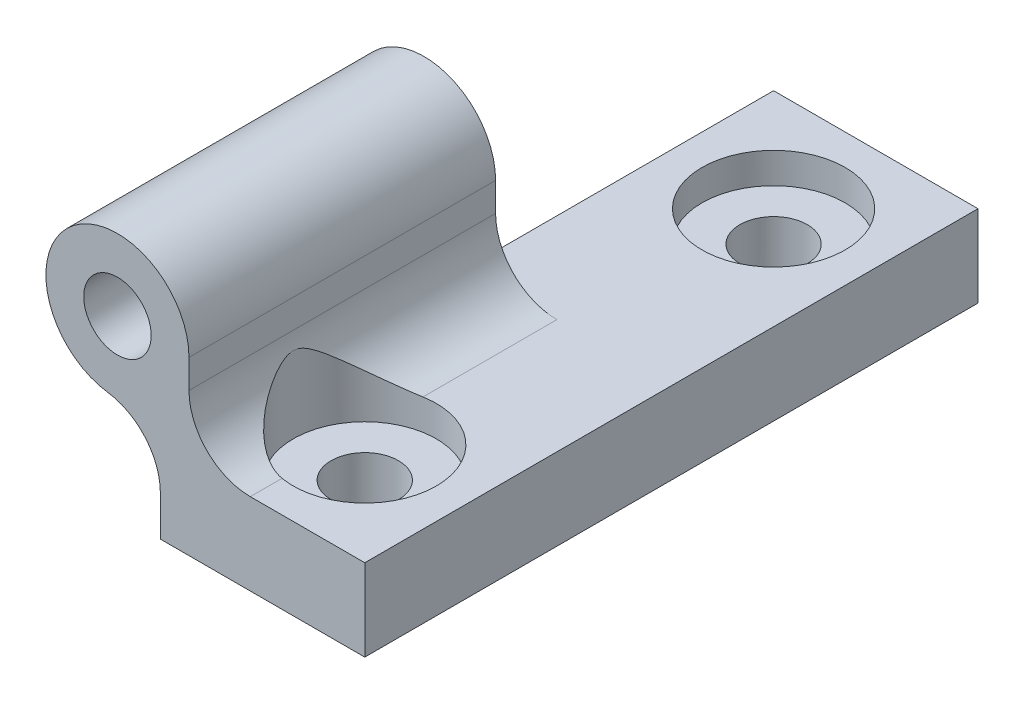
ISO-10303-21;
HEADER;
FILE_DESCRIPTION(('STEP AP214'),'2;1');
FILE_NAME('part.step','',(''),(''),'','','');
FILE_SCHEMA(('AUTOMOTIVE_DESIGN { 1 0 10303 214 1 1 1 1 }'));
ENDSEC;
DATA;
#1=APPLICATION_CONTEXT('core data for automotive mechanical design processes');
#2=APPLICATION_PROTOCOL_DEFINITION('international standard','automotive_design',2000,#1);
#3=PRODUCT_CONTEXT('',#1,'mechanical');
#4=PRODUCT('Part','Part','',(#3));
#5=PRODUCT_RELATED_PRODUCT_CATEGORY('part','',(#4));
#6=PRODUCT_DEFINITION_FORMATION('','',#4);
#7=PRODUCT_DEFINITION_CONTEXT('part definition',#1,'design');
#8=PRODUCT_DEFINITION('design','',#6,#7);
#9=PRODUCT_DEFINITION_SHAPE('','',#8);
#10=(LENGTH_UNIT() NAMED_UNIT(*) SI_UNIT(.MILLI.,.METRE.));
#11=(NAMED_UNIT(*) PLANE_ANGLE_UNIT() SI_UNIT($,.RADIAN.));
#12=(NAMED_UNIT(*) SI_UNIT($,.STERADIAN.) SOLID_ANGLE_UNIT());
#13=UNCERTAINTY_MEASURE_WITH_UNIT(LENGTH_MEASURE(1.E-05),#10,'distance_accuracy_value','');
#14=(GEOMETRIC_REPRESENTATION_CONTEXT(3) GLOBAL_UNCERTAINTY_ASSIGNED_CONTEXT((#13)) GLOBAL_UNIT_ASSIGNED_CONTEXT((#10,
#11,#12)) REPRESENTATION_CONTEXT('',''));
#15=CARTESIAN_POINT('',(0.,0.,0.));
#16=DIRECTION('',(0.,0.,1.));
#17=DIRECTION('',(1.,0.,0.));
#18=AXIS2_PLACEMENT_3D('',#15,#16,#17);
#19=CARTESIAN_POINT('',(4.4,7.,-30.));
#20=DIRECTION('',(0.,0.,-1.));
#21=DIRECTION('',(-1.,0.,0.));
#22=AXIS2_PLACEMENT_3D('',#19,#20,#21);
#23=CYLINDRICAL_SURFACE('',#22,3.);
#24=CARTESIAN_POINT('',(5.,9.93938769133981,-8.5));
#25=CARTESIAN_POINT('',(5.14616523007527,9.90954889476214,-8.49999797530727));
#26=CARTESIAN_POINT('',(5.29009314929453,9.86873614830836,-8.49076872619049));
#27=CARTESIAN_POINT('',(5.56862581763732,9.7670136978381,-8.45636031064131));
#28=CARTESIAN_POINT('',(5.70322140635735,9.70608457672708,-8.43116571215736));
#29=CARTESIAN_POINT('',(5.95881284678429,9.56731667401858,-8.36866096336098));
#30=CARTESIAN_POINT('',(6.07990240958712,9.48960704129906,-8.33144232518242));
#31=CARTESIAN_POINT('',(6.30797443263063,9.3194614526653,-8.24868261273146));
#32=CARTESIAN_POINT('',(6.41495295198813,9.22702139873873,-8.20313922198764));
#33=CARTESIAN_POINT('',(6.62647969760225,9.01686410429554,-8.10161117528796));
#34=CARTESIAN_POINT('',(6.72903281034261,8.89743016739083,-8.04503363657305));
#35=CARTESIAN_POINT('',(6.91440752632228,8.64390937103713,-7.93203441609619));
#36=CARTESIAN_POINT('',(6.99721576606571,8.50981267674029,-7.87561286529246));
#37=CARTESIAN_POINT('',(7.13464122132546,8.24183052711168,-7.77485912082494));
#38=CARTESIAN_POINT('',(7.19122032191812,8.10920021529855,-7.72988453111071));
#39=CARTESIAN_POINT('',(7.28534084584629,7.83416122212644,-7.65160224912541));
#40=CARTESIAN_POINT('',(7.32292203765841,7.69177368161188,-7.61827023097746));
#41=CARTESIAN_POINT('',(7.37251633403228,7.42375033505116,-7.57334675038038));
#42=CARTESIAN_POINT('',(7.38769569882036,7.29916076685386,-7.55909949770294));
#43=CARTESIAN_POINT('',(7.40223557391895,7.04829195910606,-7.54546300774461));
#44=CARTESIAN_POINT('',(7.401609152729,6.92201420172669,-7.54606149573947));
#45=CARTESIAN_POINT('',(7.38462372550094,6.67176429150367,-7.56196893795489));
#46=CARTESIAN_POINT('',(7.36829447282878,6.54778823022219,-7.5772500717882));
#47=CARTESIAN_POINT('',(7.32096487448203,6.30476918576845,-7.6199459707029));
#48=CARTESIAN_POINT('',(7.2899410503671,6.18573442985234,-7.6473801489094));
#49=CARTESIAN_POINT('',(7.19995567312367,5.90971996294337,-7.72301743513854));
#50=CARTESIAN_POINT('',(7.13483184109238,5.75583924913466,-7.77514968993084));
#51=CARTESIAN_POINT('',(6.98154685233603,5.46277298756185,-7.88660149527526));
#52=CARTESIAN_POINT('',(6.89334173582287,5.32361620044896,-7.94593464350332));
#53=CARTESIAN_POINT('',(6.69338178426066,5.05874813415473,-8.06533980344106));
#54=CARTESIAN_POINT('',(6.58119381061948,4.93335898759396,-8.12540306817026));
#55=CARTESIAN_POINT('',(6.3355016807538,4.70168757657788,-8.23799913269674));
#56=CARTESIAN_POINT('',(6.20203396805717,4.59537329457342,-8.29054452078622));
#57=CARTESIAN_POINT('',(5.94292280584148,4.42342762598627,-8.37278639694261));
#58=CARTESIAN_POINT('',(5.82064881172979,4.35390426766148,-8.40492978469583));
#59=CARTESIAN_POINT('',(5.56530751444939,4.23196330542529,-8.45649318144039));
#60=CARTESIAN_POINT('',(5.4322476626993,4.17953401571973,-8.47592189159005));
#61=CARTESIAN_POINT('',(5.15782137358227,4.09371704972252,-8.49916369532805));
#62=CARTESIAN_POINT('',(5.01640923416799,4.06044742820154,-8.50288085095849));
#63=CARTESIAN_POINT('',(4.73088781196453,4.01480546110324,-8.49255632321381));
#64=CARTESIAN_POINT('',(4.58677958462502,4.00242510410137,-8.47852145168877));
#65=CARTESIAN_POINT('',(4.31553676286155,3.99843106951048,-8.43489237111817));
#66=CARTESIAN_POINT('',(4.18814643495097,4.00486368278833,-8.40699529285465));
#67=CARTESIAN_POINT('',(3.93886371319041,4.03299872527093,-8.33777371860158));
#68=CARTESIAN_POINT('',(3.81697227070366,4.05470378606557,-8.29644690920047));
#69=CARTESIAN_POINT('',(3.57583628038878,4.11264300906801,-8.19990490092087));
#70=CARTESIAN_POINT('',(3.45695997337507,4.14948914871436,-8.14414669719342));
#71=CARTESIAN_POINT('',(3.22952060533393,4.23508249018059,-8.02193707454139));
#72=CARTESIAN_POINT('',(3.12096203112408,4.28383483699196,-7.95548103703888));
#73=CARTESIAN_POINT('',(2.85854597049393,4.42004967815323,-7.77516402810462));
#74=CARTESIAN_POINT('',(2.71228512455993,4.51412063781005,-7.65522017002793));
#75=CARTESIAN_POINT('',(2.44574190982451,4.7176476638258,-7.40000473298248));
#76=CARTESIAN_POINT('',(2.32554601269479,4.82715301061528,-7.26468433753864));
#77=CARTESIAN_POINT('',(2.14539100468904,5.01810916007534,-7.02866297442145));
#78=CARTESIAN_POINT('',(2.07856947844767,5.09706595149263,-6.93105986034486));
#79=CARTESIAN_POINT('',(1.95580428696465,5.25755250141986,-6.73108482182953));
#80=CARTESIAN_POINT('',(1.89986938078644,5.33908427089117,-6.62870913892621));
#81=CARTESIAN_POINT('',(1.79864694753764,5.5026148457096,-6.41945481477322));
#82=CARTESIAN_POINT('',(1.75334326942948,5.58461274621642,-6.3125832987868));
#83=CARTESIAN_POINT('',(1.69317542470313,5.7057277772819,-6.14817281461985));
#84=CARTESIAN_POINT('',(1.67442430751721,5.74576770510329,-6.09271209112502));
#85=CARTESIAN_POINT('',(1.6395162425719,5.82459204874285,-5.98011424936832));
#86=CARTESIAN_POINT('',(1.6233586893842,5.86337675588066,-5.92297752603734));
#87=CARTESIAN_POINT('',(1.59020502560092,5.94760156785077,-5.79297293437266));
#88=CARTESIAN_POINT('',(1.57389891804643,5.99247277067748,-5.71955501831174));
#89=CARTESIAN_POINT('',(1.54558700443448,6.0757508735677,-5.56828271821682));
#90=CARTESIAN_POINT('',(1.53357426626532,6.11416814056357,-5.49043572320223));
#91=CARTESIAN_POINT('',(1.51771916104109,6.16755302184325,-5.35586682397735));
#92=CARTESIAN_POINT('',(1.51248799913627,6.18606738488119,-5.30077006555895));
#93=CARTESIAN_POINT('',(1.50461857964243,6.21451283308225,-5.18831031383168));
#94=CARTESIAN_POINT('',(1.50197028035487,6.22447714097927,-5.13095700630292));
#95=CARTESIAN_POINT('',(1.49954493773438,6.23358432666008,-5.01468232521382));
#96=CARTESIAN_POINT('',(1.49979700854609,6.23261747831335,-4.95575098676155));
#97=CARTESIAN_POINT('',(1.50320938533872,6.21984735860229,-4.83911349250408));
#98=CARTESIAN_POINT('',(1.50637713527786,6.20801635036342,-4.78141085965629));
#99=CARTESIAN_POINT('',(1.51737799797032,6.16870357562694,-4.64174269858473));
#100=CARTESIAN_POINT('',(1.5267150257392,6.13645017587915,-4.56131954861776));
#101=CARTESIAN_POINT('',(1.54995925275707,6.06256597973772,-4.40545180547919));
#102=CARTESIAN_POINT('',(1.56389230782748,6.02088255968393,-4.330038347314));
#103=CARTESIAN_POINT('',(1.59201711712035,5.94334749393929,-4.20068854895772));
#104=CARTESIAN_POINT('',(1.60534200585179,5.90850174725421,-4.14594625414423));
#105=CARTESIAN_POINT('',(1.63428470177588,5.83711388778591,-4.03819225471347));
#106=CARTESIAN_POINT('',(1.64990318673521,5.80057127576249,-3.98518106732487));
#107=CARTESIAN_POINT('',(1.70018567659167,5.68942763365335,-3.82810056233713));
#108=CARTESIAN_POINT('',(1.73824708128058,5.61339589237391,-3.72611780774876));
#109=CARTESIAN_POINT('',(1.82347209831521,5.46078557625666,-3.52642153627647));
#110=CARTESIAN_POINT('',(1.87063961746568,5.38420678034437,-3.42870987396997));
#111=CARTESIAN_POINT('',(1.97428474477503,5.23241836184155,-3.23736692615516));
#112=CARTESIAN_POINT('',(2.03075454899933,5.15720764976419,-3.14373230285922));
#113=CARTESIAN_POINT('',(2.14328745657393,5.02169809395881,-2.97573347262212));
#114=CARTESIAN_POINT('',(2.19789092553043,4.96098063002829,-2.9007320747863));
#115=CARTESIAN_POINT('',(2.31404530936469,4.84229336601027,-2.75402269441648));
#116=CARTESIAN_POINT('',(2.37559749396369,4.78432407084548,-2.68231531716938));
#117=CARTESIAN_POINT('',(2.57077308973386,4.61602051749601,-2.47311926596463));
#118=CARTESIAN_POINT('',(2.71523585729514,4.5108908170855,-2.3410685214944));
#119=CARTESIAN_POINT('',(2.99004145078963,4.34856405565603,-2.13097374900376));
#120=CARTESIAN_POINT('',(3.11353446470086,4.28610759201297,-2.04801022867436));
#121=CARTESIAN_POINT('',(3.3753638778029,4.17685264849075,-1.89623503965168));
#122=CARTESIAN_POINT('',(3.51368297545885,4.13003617446302,-1.82740714299792));
#123=CARTESIAN_POINT('',(3.78059188914709,4.06192502098001,-1.71661691309092));
#124=CARTESIAN_POINT('',(3.90741589070442,4.03781579642086,-1.67215242967631));
#125=CARTESIAN_POINT('',(4.16729060007702,4.00618308073237,-1.59782194259235));
#126=CARTESIAN_POINT('',(4.30033757868726,3.99864978306917,-1.56794731551901));
#127=CARTESIAN_POINT('',(4.56929006771349,4.00175421985363,-1.52392279967813));
#128=CARTESIAN_POINT('',(4.70520352714315,4.01245167672972,-1.50982484475363));
#129=CARTESIAN_POINT('',(4.97499310818802,4.05246164453546,-1.49748426996542));
#130=CARTESIAN_POINT('',(5.1088689859179,4.08177636616548,-1.4992435333887));
#131=CARTESIAN_POINT('',(5.36374646984714,4.15607102300492,-1.51672640664668));
#132=CARTESIAN_POINT('',(5.48505658534421,4.20017904903851,-1.53173573447827));
#133=CARTESIAN_POINT('',(5.71945142088979,4.30269977211478,-1.57267433642544));
#134=CARTESIAN_POINT('',(5.832534361213,4.36111555238702,-1.59860596509497));
#135=CARTESIAN_POINT('',(6.05989034850475,4.49718438305635,-1.66204221404656));
#136=CARTESIAN_POINT('',(6.17308657400587,4.57619904328656,-1.70046366080128));
#137=CARTESIAN_POINT('',(6.38615826468599,4.7474692436521,-1.78414948232777));
#138=CARTESIAN_POINT('',(6.48602240494422,4.83973590432355,-1.82941960594701));
#139=CARTESIAN_POINT('',(6.68990312151616,5.05514765277088,-1.93247934010799));
#140=CARTESIAN_POINT('',(6.79090954823491,5.18080225410772,-1.99098551426016));
#141=CARTESIAN_POINT('',(6.97193366379524,5.44722691924573,-2.10638702362663));
#142=CARTESIAN_POINT('',(7.05194211692452,5.58800359607794,-2.16328164023454));
#143=CARTESIAN_POINT('',(7.17882042622236,5.86103027278923,-2.25990768715716));
#144=CARTESIAN_POINT('',(7.22887645562897,5.99133303498065,-2.30093346017679));
#145=CARTESIAN_POINT('',(7.31085307333647,6.26066656712456,-2.37075952893159));
#146=CARTESIAN_POINT('',(7.3428090436279,6.39967971476728,-2.39958364838072));
#147=CARTESIAN_POINT('',(7.37583328578685,6.6130814886964,-2.42985888162811));
#148=CARTESIAN_POINT('',(7.38436166528288,6.68546954287469,-2.43779812412964));
#149=CARTESIAN_POINT('',(7.39612544421322,6.83102870476301,-2.4487937162081));
#150=CARTESIAN_POINT('',(7.3993635244611,6.90419939694435,-2.45185253887732));
#151=CARTESIAN_POINT('',(7.40046632531864,7.05061461345554,-2.45289148981154));
#152=CARTESIAN_POINT('',(7.39833125727157,7.12385913476818,-2.45087181783016));
#153=CARTESIAN_POINT('',(7.38874920026089,7.26967306803293,-2.44189207020435));
#154=CARTESIAN_POINT('',(7.38130237260508,7.34224250041838,-2.43493214458584));
#155=CARTESIAN_POINT('',(7.35418676179592,7.53670702731869,-2.4099488994571));
#156=CARTESIAN_POINT('',(7.32960573525894,7.65739858994502,-2.387587308853));
#157=CARTESIAN_POINT('',(7.26669979307112,7.89271184517695,-2.33283170082146));
#158=CARTESIAN_POINT('',(7.22835934880116,8.00732651108943,-2.30042635385729));
#159=CARTESIAN_POINT('',(7.11841166512631,8.28099586188417,-2.21265629923126));
#160=CARTESIAN_POINT('',(7.03962298210082,8.43599986220788,-2.1536145896595));
#161=CARTESIAN_POINT('',(6.85751527443179,8.72930926068701,-2.03154976910234));
#162=CARTESIAN_POINT('',(6.75414906777972,8.86758175896542,-1.96851917349754));
#163=CARTESIAN_POINT('',(6.52276338383331,9.12707200690791,-1.84586461798307));
#164=CARTESIAN_POINT('',(6.39445997670634,9.24806245025797,-1.78629127578618));
#165=CARTESIAN_POINT('',(6.11558097121678,9.4674011419989,-1.67920836377664));
#166=CARTESIAN_POINT('',(5.96506158058784,9.56580497551624,-1.63166914790906));
#167=CARTESIAN_POINT('',(5.68646711457618,9.71349131725052,-1.56581325682075));
#168=CARTESIAN_POINT('',(5.56266746277021,9.76889550213797,-1.54311762605577));
#169=CARTESIAN_POINT('',(5.30714925839275,9.86278797692952,-1.51113411000051));
#170=CARTESIAN_POINT('',(5.17543674944662,9.90128899488777,-1.50183612422622));
#171=CARTESIAN_POINT('',(4.9072273775003,9.96000548382571,-1.49865197693063));
#172=CARTESIAN_POINT('',(4.77071389231894,9.98014922100593,-1.50482592511701));
#173=CARTESIAN_POINT('',(4.4979225029619,10.001521108683,-1.53348553830348));
#174=CARTESIAN_POINT('',(4.36164460021518,10.0027491448436,-1.55597130189971));
#175=CARTESIAN_POINT('',(4.10173061719173,9.98780545106763,-1.61476462234758));
#176=CARTESIAN_POINT('',(3.97782496960229,9.97266544625048,-1.65016942510248));
#177=CARTESIAN_POINT('',(3.736915826882,9.92836941938699,-1.73336698778613));
#178=CARTESIAN_POINT('',(3.61991543303177,9.89920715265531,-1.78116526265963));
#179=CARTESIAN_POINT('',(3.35519440794114,9.81668938582495,-1.90599654296957));
#180=CARTESIAN_POINT('',(3.21106109782545,9.7584381260873,-1.98740584890103));
#181=CARTESIAN_POINT('',(2.94083360468298,9.62556954570986,-2.16519422084317));
#182=CARTESIAN_POINT('',(2.81476560121649,9.55092886270106,-2.26159459811229));
#183=CARTESIAN_POINT('',(2.53804562584356,9.36023892017161,-2.50324883994596));
#184=CARTESIAN_POINT('',(2.39527168192856,9.23903038375526,-2.65347345625105));
#185=CARTESIAN_POINT('',(2.20543183532914,9.04744297649457,-2.89033076215936));
#186=CARTESIAN_POINT('',(2.14608270704094,8.98176730673901,-2.97142987167407));
#187=CARTESIAN_POINT('',(2.03530159597374,8.84816599108323,-3.13707794811826));
#188=CARTESIAN_POINT('',(1.98386575170226,8.78024146236252,-3.22162520678894));
#189=CARTESIAN_POINT('',(1.88692935083589,8.64071571501876,-3.39712340963562));
#190=CARTESIAN_POINT('',(1.84171273150536,8.56907062845467,-3.48819541954925));
#191=CARTESIAN_POINT('',(1.75922208355237,8.42587865653804,-3.67420616002936));
#192=CARTESIAN_POINT('',(1.72196152543221,8.35433213834661,-3.76915112935042));
#193=CARTESIAN_POINT('',(1.65557429941299,8.21410768257909,-3.96303755333325));
#194=CARTESIAN_POINT('',(1.62639981399601,8.14541501635126,-4.06195137324635));
#195=CARTESIAN_POINT('',(1.58873769634263,8.0478701819436,-4.21512643299358));
#196=CARTESIAN_POINT('',(1.57721226969836,8.01631169948029,-4.26690889666662));
#197=CARTESIAN_POINT('',(1.55627747070524,7.9561642791744,-4.37256295203854));
#198=CARTESIAN_POINT('',(1.54686652135307,7.92757313687396,-4.42643295143316));
#199=CARTESIAN_POINT('',(1.52957812526468,7.87268225047824,-4.54186546874939));
#200=CARTESIAN_POINT('',(1.52191891570003,7.8468295335154,-4.60368141376525));
#201=CARTESIAN_POINT('',(1.50981193351153,7.80455498531944,-4.73056670339834));
#202=CARTESIAN_POINT('',(1.5053443341531,7.78807506178112,-4.79561322921151));
#203=CARTESIAN_POINT('',(1.50063338334757,7.77054827839645,-4.9148582268509));
#204=CARTESIAN_POINT('',(1.49972918382329,7.76709322109237,-4.96865698801744));
#205=CARTESIAN_POINT('',(1.50041353318516,7.76967465175709,-5.07604227635759));
#206=CARTESIAN_POINT('',(1.50200438056122,7.77571989161064,-5.12962856219199));
#207=CARTESIAN_POINT('',(1.50847883757195,7.79955856763176,-5.25379541988602));
#208=CARTESIAN_POINT('',(1.51433305526817,7.82076822020047,-5.32363462322017));
#209=CARTESIAN_POINT('',(1.52960429998863,7.87267288510314,-5.45943176480063));
#210=CARTESIAN_POINT('',(1.53904198635719,7.9034227065597,-5.52536458437045));
#211=CARTESIAN_POINT('',(1.56653992143578,7.98705319953148,-5.68628355896013));
#212=CARTESIAN_POINT('',(1.58654826122632,8.04327332945565,-5.77914966237248));
#213=CARTESIAN_POINT('',(1.63294496780719,8.16080117664488,-5.96002480971579));
#214=CARTESIAN_POINT('',(1.65934716778963,8.22211973292208,-6.04802280734517));
#215=CARTESIAN_POINT('',(1.71848812263291,8.34695206686566,-6.22066283914076));
#216=CARTESIAN_POINT('',(1.75124469142043,8.41047159366122,-6.30529461325307));
#217=CARTESIAN_POINT('',(1.82306261009072,8.53777124344175,-6.47147930201054));
#218=CARTESIAN_POINT('',(1.86211806756065,8.60155106909643,-6.55303500708853));
#219=CARTESIAN_POINT('',(1.95033592507959,8.73377906273952,-6.7202407080186));
#220=CARTESIAN_POINT('',(2.00007773903045,8.80215870964306,-6.80564233484958));
#221=CARTESIAN_POINT('',(2.10742443845769,8.93688718541044,-6.97304386835727));
#222=CARTESIAN_POINT('',(2.16503230593595,9.00323523236537,-7.05504246950901));
#223=CARTESIAN_POINT('',(2.34976426398501,9.19734846182452,-7.29497189852978));
#224=CARTESIAN_POINT('',(2.48914345763117,9.3207249454987,-7.44750625273976));
#225=CARTESIAN_POINT('',(2.75725577997425,9.51403810346509,-7.69126130458518));
#226=CARTESIAN_POINT('',(2.87766081400753,9.58917373821798,-7.78755142609593));
#227=CARTESIAN_POINT('',(3.13591905064618,9.7245691018084,-7.96644324416862));
#228=CARTESIAN_POINT('',(3.27375438435676,9.78484388137557,-8.04905876194185));
#229=CARTESIAN_POINT('',(3.540576999644,9.87711711307747,-8.18410095212652));
#230=CARTESIAN_POINT('',(3.66710395672106,9.9121766985561,-8.23927107083013));
#231=CARTESIAN_POINT('',(3.92891941575503,9.965785565096,-8.33498907509241));
#232=CARTESIAN_POINT('',(4.06420028406902,9.98434902849632,-8.37554950327557));
#233=CARTESIAN_POINT('',(4.33311417327515,10.0021267361543,-8.43851306856374));
#234=CARTESIAN_POINT('',(4.46649683422619,10.0022539618428,-8.46171615766997));
#235=CARTESIAN_POINT('',(4.73386263895155,9.98437382803468,-8.49246064687384));
#236=CARTESIAN_POINT('',(4.86784579099572,9.96636621802042,-8.50000183061093));
#237=CARTESIAN_POINT('',(5.,9.93938769133981,-8.5));
#238=B_SPLINE_CURVE_WITH_KNOTS('',3,(#24,#25,#26,#27,#28,#29,#30,#31,#32,#33,#34,#35,#36,#37,
#38,#39,#40,#41,#42,#43,#44,#45,#46,#47,#48,#49,#50,#51,#52,#53,#54,#55,#56,#57,#58,#59,#60,#61,
#62,#63,#64,#65,#66,#67,#68,#69,#70,#71,#72,#73,#74,#75,#76,#77,#78,#79,#80,#81,#82,#83,#84,#85,
#86,#87,#88,#89,#90,#91,#92,#93,#94,#95,#96,#97,#98,#99,#100,#101,#102,#103,#104,#105,#106,#107,
#108,#109,#110,#111,#112,#113,#114,#115,#116,#117,#118,#119,#120,#121,#122,#123,#124,#125,#126,
#127,#128,#129,#130,#131,#132,#133,#134,#135,#136,#137,#138,#139,#140,#141,#142,#143,#144,#145,
#146,#147,#148,#149,#150,#151,#152,#153,#154,#155,#156,#157,#158,#159,#160,#161,#162,#163,#164,
#165,#166,#167,#168,#169,#170,#171,#172,#173,#174,#175,#176,#177,#178,#179,#180,#181,#182,#183,
#184,#185,#186,#187,#188,#189,#190,#191,#192,#193,#194,#195,#196,#197,#198,#199,#200,#201,#202,
#203,#204,#205,#206,#207,#208,#209,#210,#211,#212,#213,#214,#215,#216,#217,#218,#219,#220,#221,
#222,#223,#224,#225,#226,#227,#228,#229,#230,#231,#232,#233,#234,#235,#236,#237),.UNSPECIFIED.,
.T.,.F.,(4,2,2,2,2,2,2,2,2,2,2,2,2,2,2,2,2,2,2,2,2,2,2,2,2,2,2,2,2,2,2,2,2,2,2,2,2,2,2,2,2,2,2,
2,2,2,2,2,2,2,2,2,2,2,2,2,2,2,2,2,2,2,2,2,2,2,2,2,2,2,2,2,2,2,2,2,2,2,2,2,2,2,2,2,2,2,2,2,2,2,2,
2,2,2,2,2,2,2,2,2,2,2,2,2,2,2,4),(0.,0.446933418253341,0.894299501147117,1.33833797492452,
1.78250019684355,2.28248319829206,2.7828036379714,3.23432388441307,3.68489500483457,
4.06211917883917,4.43903146754538,4.81523099575943,5.19203363970511,5.71435224921532,
6.2376729814895,6.77139289446253,7.30420839130059,7.73531967850503,8.16613562978073,
8.59957846463427,9.03285502821837,9.42278392370031,9.81278002414761,10.2203917330581,
10.6281798945611,11.2584354260576,11.890750912685,12.3169023417363,12.743395235397,
13.1692359415575,13.3819593066746,13.5946329422951,13.8571197113442,14.1191807316646,
14.293742009048,14.4676218861163,14.6432486933377,14.8193251370951,15.0793142403481,
15.3407916423834,15.5394304419863,15.7381280586939,16.1360047948809,16.5340526133709,
16.9317681838675,17.2640934831119,17.5964796059087,18.2591495607101,18.7415475640709,
19.2233886310804,19.6312648857392,20.0388997705492,20.4478726015549,20.856894004974,
21.2451269070873,21.6334435446294,22.0617516226922,22.4904212423908,23.0029586251036,
23.5157210649893,23.950681599089,24.3847889117296,24.6044419996871,24.8239837457716,
25.0435168567046,25.263043301128,25.6369593110308,26.0112986494558,26.5592998447443,
27.108361666653,27.6640859550158,28.2184275939441,28.6292795452468,29.0398215929289,
29.4519611002609,29.8641030987752,30.2517038587948,30.6394773933443,31.1630235943725,
31.6873209880174,32.4034197719181,32.7633508832569,33.1231057959324,33.4959462106419,
33.8694129664125,34.2406216428048,34.4257032150258,34.61064628951,34.8124622450252,
35.0130133242725,35.173888383568,35.3349117314379,35.5532595648797,35.7728858114077,
36.1032913505371,36.4344182144551,36.7664871411582,37.0982472106202,37.4584479998353,
37.8187857213888,38.5367004197469,39.0495805753272,39.5619391441455,39.9874525873784,
40.41259984571,40.8166857997692,41.2207773360151),.UNSPECIFIED.);
#239=CARTESIAN_POINT('',(4.4,4.,-8.44818792991333));
#240=VERTEX_POINT('',#239);
#241=CARTESIAN_POINT('',(4.4,4.,-1.55181207008667));
#242=VERTEX_POINT('',#241);
#243=EDGE_CURVE('E55',#240,#242,#238,.T.);
#244=ORIENTED_EDGE('',*,*,#243,.F.);
#245=DIRECTION('',(0.,0.,1.));
#246=VECTOR('',#245,1.);
#247=CARTESIAN_POINT('',(4.4,4.,0.));
#248=LINE('',#247,#246);
#249=CARTESIAN_POINT('',(4.39999999999997,4.,-15.));
#250=VERTEX_POINT('',#249);
#251=EDGE_CURVE('E123',#250,#240,#248,.T.);
#252=ORIENTED_EDGE('',*,*,#251,.F.);
#253=CARTESIAN_POINT('',(4.4,7.,-15.));
#254=DIRECTION('',(0.,0.,1.));
#255=DIRECTION('',(1.,0.,0.));
#256=AXIS2_PLACEMENT_3D('',#253,#254,#255);
#257=CIRCLE('',#256,3.);
#258=CARTESIAN_POINT('',(1.4,7.,-15.));
#259=VERTEX_POINT('',#258);
#260=EDGE_CURVE('E315',#250,#259,#257,.F.);
#261=ORIENTED_EDGE('',*,*,#260,.T.);
#262=DIRECTION('',(0.,0.,1.));
#263=VECTOR('',#262,1.);
#264=CARTESIAN_POINT('',(1.4,7.,-30.));
#265=LINE('',#264,#263);
#266=CARTESIAN_POINT('',(1.4,7.,0.));
#267=VERTEX_POINT('',#266);
#268=EDGE_CURVE('E135',#267,#259,#265,.F.);
#269=ORIENTED_EDGE('',*,*,#268,.F.);
#270=CARTESIAN_POINT('',(4.4,7.,0.));
#271=DIRECTION('',(0.,0.,1.));
#272=DIRECTION('',(1.,0.,0.));
#273=AXIS2_PLACEMENT_3D('',#270,#271,#272);
#274=CIRCLE('',#273,3.);
#275=CARTESIAN_POINT('',(4.4,4.,0.));
#276=VERTEX_POINT('',#275);
#277=EDGE_CURVE('E140',#276,#267,#274,.F.);
#278=ORIENTED_EDGE('',*,*,#277,.F.);
#279=EDGE_CURVE('E125',#242,#276,#248,.T.);
#280=ORIENTED_EDGE('',*,*,#279,.F.);
#281=EDGE_LOOP('',(#244,#252,#261,#269,#278,#280));
#282=FACE_BOUND('',#281,.T.);
#283=ADVANCED_FACE('F41',(#282),#23,.F.);
#284=CARTESIAN_POINT('',(5.,11.,-5.));
#285=DIRECTION('',(0.,-1.,0.));
#286=DIRECTION('',(0.,0.,-1.));
#287=AXIS2_PLACEMENT_3D('',#284,#285,#286);
#288=CYLINDRICAL_SURFACE('',#287,1.65);
#289=CARTESIAN_POINT('',(5.,0.,-5.));
#290=DIRECTION('',(0.,-1.,0.));
#291=DIRECTION('',(0.,0.,-1.));
#292=AXIS2_PLACEMENT_3D('',#289,#290,#291);
#293=CIRCLE('',#292,1.65);
#294=CARTESIAN_POINT('',(5.,0.,-6.65));
#295=VERTEX_POINT('',#294);
#296=EDGE_CURVE('E127',#295,#295,#293,.F.);
#297=ORIENTED_EDGE('',*,*,#296,.F.);
#298=EDGE_LOOP('',(#297));
#299=FACE_BOUND('',#298,.T.);
#300=CARTESIAN_POINT('',(5.,2.5,-5.));
#301=DIRECTION('',(0.,1.,0.));
#302=DIRECTION('',(0.,0.,1.));
#303=AXIS2_PLACEMENT_3D('',#300,#301,#302);
#304=CIRCLE('',#303,1.65);
#305=CARTESIAN_POINT('',(5.,2.5,-3.35));
#306=VERTEX_POINT('',#305);
#307=EDGE_CURVE('E169',#306,#306,#304,.T.);
#308=ORIENTED_EDGE('',*,*,#307,.T.);
#309=EDGE_LOOP('',(#308));
#310=FACE_BOUND('',#309,.T.);
#311=ADVANCED_FACE('F193',(#299,#310),#288,.F.);
#312=CARTESIAN_POINT('',(5.,11.,-25.));
#313=DIRECTION('',(0.,-1.,0.));
#314=DIRECTION('',(0.,0.,-1.));
#315=AXIS2_PLACEMENT_3D('',#312,#313,#314);
#316=CYLINDRICAL_SURFACE('',#315,1.65);
#317=CARTESIAN_POINT('',(5.,0.,-25.));
#318=DIRECTION('',(0.,-1.,0.));
#319=DIRECTION('',(0.,0.,-1.));
#320=AXIS2_PLACEMENT_3D('',#317,#318,#319);
#321=CIRCLE('',#320,1.65);
#322=CARTESIAN_POINT('',(5.,0.,-26.65));
#323=VERTEX_POINT('',#322);
#324=EDGE_CURVE('E161',#323,#323,#321,.F.);
#325=ORIENTED_EDGE('',*,*,#324,.F.);
#326=EDGE_LOOP('',(#325));
#327=FACE_BOUND('',#326,.T.);
#328=CARTESIAN_POINT('',(5.,2.5,-25.));
#329=DIRECTION('',(0.,1.,0.));
#330=DIRECTION('',(0.,0.,1.));
#331=AXIS2_PLACEMENT_3D('',#328,#329,#330);
#332=CIRCLE('',#331,1.65);
#333=CARTESIAN_POINT('',(5.,2.5,-23.35));
#334=VERTEX_POINT('',#333);
#335=EDGE_CURVE('E165',#334,#334,#332,.T.);
#336=ORIENTED_EDGE('',*,*,#335,.T.);
#337=EDGE_LOOP('',(#336));
#338=FACE_BOUND('',#337,.T.);
#339=ADVANCED_FACE('F197',(#327,#338),#316,.F.);
#340=CARTESIAN_POINT('',(-2.1,8.4,-30.));
#341=DIRECTION('',(0.,0.,1.));
#342=DIRECTION('',(1.,0.,0.));
#343=AXIS2_PLACEMENT_3D('',#340,#341,#342);
#344=CYLINDRICAL_SURFACE('',#343,3.5);
#345=CARTESIAN_POINT('',(-2.1,8.4,-15.));
#346=DIRECTION('',(0.,0.,1.));
#347=DIRECTION('',(1.,0.,0.));
#348=AXIS2_PLACEMENT_3D('',#345,#346,#347);
#349=CIRCLE('',#348,3.5);
#350=CARTESIAN_POINT('',(-2.58461538461538,4.93371265919946,-15.));
#351=VERTEX_POINT('',#350);
#352=CARTESIAN_POINT('',(1.4,8.4,-15.));
#353=VERTEX_POINT('',#352);
#354=EDGE_CURVE('E322',#351,#353,#349,.F.);
#355=ORIENTED_EDGE('',*,*,#354,.F.);
#356=DIRECTION('',(0.,0.,1.));
#357=VECTOR('',#356,1.);
#358=CARTESIAN_POINT('',(-2.58461538461538,4.93371265919946,-30.));
#359=LINE('',#358,#357);
#360=CARTESIAN_POINT('',(-2.58461538461538,4.93371265919946,0.));
#361=VERTEX_POINT('',#360);
#362=EDGE_CURVE('E149',#351,#361,#359,.T.);
#363=ORIENTED_EDGE('',*,*,#362,.T.);
#364=CARTESIAN_POINT('',(-2.1,8.4,0.));
#365=DIRECTION('',(0.,0.,1.));
#366=DIRECTION('',(1.,0.,0.));
#367=AXIS2_PLACEMENT_3D('',#364,#365,#366);
#368=CIRCLE('',#367,3.5);
#369=CARTESIAN_POINT('',(1.4,8.4,0.));
#370=VERTEX_POINT('',#369);
#371=EDGE_CURVE('E251',#370,#361,#368,.T.);
#372=ORIENTED_EDGE('',*,*,#371,.F.);
#373=DIRECTION('',(0.,0.,1.));
#374=VECTOR('',#373,1.);
#375=CARTESIAN_POINT('',(1.4,8.4,-30.));
#376=LINE('',#375,#374);
#377=EDGE_CURVE('E142',#353,#370,#376,.T.);
#378=ORIENTED_EDGE('',*,*,#377,.F.);
#379=EDGE_LOOP('',(#355,#363,#372,#378));
#380=FACE_BOUND('',#379,.T.);
#381=ADVANCED_FACE('F189',(#380),#344,.T.);
#382=CARTESIAN_POINT('',(1.4,0.,-30.));
#383=DIRECTION('',(-1.,0.,0.));
#384=DIRECTION('',(0.,0.,1.));
#385=AXIS2_PLACEMENT_3D('',#382,#383,#384);
#386=PLANE('',#385);
#387=ORIENTED_EDGE('',*,*,#268,.T.);
#388=DIRECTION('',(0.,1.,0.));
#389=VECTOR('',#388,1.);
#390=CARTESIAN_POINT('',(1.4,0.,-15.));
#391=LINE('',#390,#389);
#392=EDGE_CURVE('E318',#259,#353,#391,.T.);
#393=ORIENTED_EDGE('',*,*,#392,.T.);
#394=ORIENTED_EDGE('',*,*,#377,.T.);
#395=DIRECTION('',(0.,-1.,0.));
#396=VECTOR('',#395,1.);
#397=CARTESIAN_POINT('',(1.4,0.,0.));
#398=LINE('',#397,#396);
#399=EDGE_CURVE('E256',#370,#267,#398,.T.);
#400=ORIENTED_EDGE('',*,*,#399,.T.);
#401=EDGE_LOOP('',(#387,#393,#394,#400));
#402=FACE_BOUND('',#401,.T.);
#403=ADVANCED_FACE('F180',(#402),#386,.F.);
#404=CARTESIAN_POINT('',(0.,4.,-30.));
#405=DIRECTION('',(0.,-1.,0.));
#406=DIRECTION('',(0.,0.,-1.));
#407=AXIS2_PLACEMENT_3D('',#404,#405,#406);
#408=PLANE('',#407);
#409=CARTESIAN_POINT('',(5.,4.,-5.));
#410=DIRECTION('',(0.,-1.,0.));
#411=DIRECTION('',(0.,0.,-1.));
#412=AXIS2_PLACEMENT_3D('',#409,#410,#411);
#413=CIRCLE('',#412,3.5);
#414=EDGE_CURVE('E11',#242,#240,#413,.F.);
#415=ORIENTED_EDGE('',*,*,#414,.F.);
#416=ORIENTED_EDGE('',*,*,#279,.T.);
#417=DIRECTION('',(1.,0.,0.));
#418=VECTOR('',#417,1.);
#419=CARTESIAN_POINT('',(0.,4.,0.));
#420=LINE('',#419,#418);
#421=CARTESIAN_POINT('',(10.,4.,0.));
#422=VERTEX_POINT('',#421);
#423=EDGE_CURVE('E277',#276,#422,#420,.T.);
#424=ORIENTED_EDGE('',*,*,#423,.T.);
#425=DIRECTION('',(0.,0.,1.));
#426=VECTOR('',#425,1.);
#427=CARTESIAN_POINT('',(10.,4.,-30.));
#428=LINE('',#427,#426);
#429=CARTESIAN_POINT('',(10.,4.,-30.));
#430=VERTEX_POINT('',#429);
#431=EDGE_CURVE('E285',#430,#422,#428,.T.);
#432=ORIENTED_EDGE('',*,*,#431,.F.);
#433=DIRECTION('',(1.,0.,0.));
#434=VECTOR('',#433,1.);
#435=CARTESIAN_POINT('',(0.,4.,-30.));
#436=LINE('',#435,#434);
#437=CARTESIAN_POINT('',(0.,4.,-30.));
#438=VERTEX_POINT('',#437);
#439=EDGE_CURVE('E295',#438,#430,#436,.T.);
#440=ORIENTED_EDGE('',*,*,#439,.F.);
#441=DIRECTION('',(0.,0.,-1.));
#442=VECTOR('',#441,1.);
#443=CARTESIAN_POINT('',(0.,4.,-15.));
#444=LINE('',#443,#442);
#445=CARTESIAN_POINT('',(0.,4.,-15.));
#446=VERTEX_POINT('',#445);
#447=EDGE_CURVE('E325',#446,#438,#444,.T.);
#448=ORIENTED_EDGE('',*,*,#447,.F.);
#449=DIRECTION('',(-1.,0.,0.));
#450=VECTOR('',#449,1.);
#451=CARTESIAN_POINT('',(4.39999999999997,4.,-15.));
#452=LINE('',#451,#450);
#453=EDGE_CURVE('E133',#250,#446,#452,.T.);
#454=ORIENTED_EDGE('',*,*,#453,.F.);
#455=ORIENTED_EDGE('',*,*,#251,.T.);
#456=EDGE_LOOP('',(#415,#416,#424,#432,#440,#448,#454,#455));
#457=FACE_BOUND('',#456,.T.);
#458=CARTESIAN_POINT('',(5.,4.,-25.));
#459=DIRECTION('',(0.,-1.,0.));
#460=DIRECTION('',(0.,0.,-1.));
#461=AXIS2_PLACEMENT_3D('',#458,#459,#460);
#462=CIRCLE('',#461,3.5);
#463=CARTESIAN_POINT('',(5.,4.,-28.5));
#464=VERTEX_POINT('',#463);
#465=EDGE_CURVE('E128',#464,#464,#462,.F.);
#466=ORIENTED_EDGE('',*,*,#465,.F.);
#467=EDGE_LOOP('',(#466));
#468=FACE_BOUND('',#467,.T.);
#469=ADVANCED_FACE('F131',(#457,#468),#408,.F.);
#470=CARTESIAN_POINT('',(10.,0.,-30.));
#471=DIRECTION('',(1.,0.,0.));
#472=DIRECTION('',(0.,0.,-1.));
#473=AXIS2_PLACEMENT_3D('',#470,#471,#472);
#474=PLANE('',#473);
#475=DIRECTION('',(0.,1.,0.));
#476=VECTOR('',#475,1.);
#477=CARTESIAN_POINT('',(10.,0.,0.));
#478=LINE('',#477,#476);
#479=CARTESIAN_POINT('',(10.,0.,0.));
#480=VERTEX_POINT('',#479);
#481=EDGE_CURVE('E273',#480,#422,#478,.T.);
#482=ORIENTED_EDGE('',*,*,#481,.F.);
#483=DIRECTION('',(0.,0.,1.));
#484=VECTOR('',#483,1.);
#485=CARTESIAN_POINT('',(10.,0.,-30.));
#486=LINE('',#485,#484);
#487=CARTESIAN_POINT('',(10.,0.,-30.));
#488=VERTEX_POINT('',#487);
#489=EDGE_CURVE('E288',#488,#480,#486,.T.);
#490=ORIENTED_EDGE('',*,*,#489,.F.);
#491=DIRECTION('',(0.,1.,0.));
#492=VECTOR('',#491,1.);
#493=CARTESIAN_POINT('',(10.,0.,-30.));
#494=LINE('',#493,#492);
#495=EDGE_CURVE('E299',#488,#430,#494,.T.);
#496=ORIENTED_EDGE('',*,*,#495,.T.);
#497=ORIENTED_EDGE('',*,*,#431,.T.);
#498=EDGE_LOOP('',(#482,#490,#496,#497));
#499=FACE_BOUND('',#498,.T.);
#500=ADVANCED_FACE('F179',(#499),#474,.T.);
#501=CARTESIAN_POINT('',(0.,0.,-30.));
#502=DIRECTION('',(0.,-1.,0.));
#503=DIRECTION('',(0.,0.,-1.));
#504=AXIS2_PLACEMENT_3D('',#501,#502,#503);
#505=PLANE('',#504);
#506=ORIENTED_EDGE('',*,*,#296,.T.);
#507=EDGE_LOOP('',(#506));
#508=FACE_BOUND('',#507,.T.);
#509=ORIENTED_EDGE('',*,*,#324,.T.);
#510=EDGE_LOOP('',(#509));
#511=FACE_BOUND('',#510,.T.);
#512=DIRECTION('',(1.,0.,0.));
#513=VECTOR('',#512,1.);
#514=CARTESIAN_POINT('',(0.,0.,0.));
#515=LINE('',#514,#513);
#516=CARTESIAN_POINT('',(0.,0.,0.));
#517=VERTEX_POINT('',#516);
#518=EDGE_CURVE('E264',#517,#480,#515,.T.);
#519=ORIENTED_EDGE('',*,*,#518,.F.);
#520=DIRECTION('',(0.,0.,1.));
#521=VECTOR('',#520,1.);
#522=CARTESIAN_POINT('',(0.,0.,-30.));
#523=LINE('',#522,#521);
#524=CARTESIAN_POINT('',(0.,0.,-30.));
#525=VERTEX_POINT('',#524);
#526=EDGE_CURVE('E144',#525,#517,#523,.T.);
#527=ORIENTED_EDGE('',*,*,#526,.F.);
#528=DIRECTION('',(1.,0.,0.));
#529=VECTOR('',#528,1.);
#530=CARTESIAN_POINT('',(0.,0.,-30.));
#531=LINE('',#530,#529);
#532=EDGE_CURVE('E305',#525,#488,#531,.T.);
#533=ORIENTED_EDGE('',*,*,#532,.T.);
#534=ORIENTED_EDGE('',*,*,#489,.T.);
#535=EDGE_LOOP('',(#519,#527,#533,#534));
#536=FACE_BOUND('',#535,.T.);
#537=ADVANCED_FACE('F186',(#508,#511,#536),#505,.T.);
#538=CARTESIAN_POINT('',(-2.1,8.4,-30.));
#539=DIRECTION('',(0.,0.,1.));
#540=DIRECTION('',(1.,0.,0.));
#541=AXIS2_PLACEMENT_3D('',#538,#539,#540);
#542=CYLINDRICAL_SURFACE('',#541,1.65);
#543=CARTESIAN_POINT('',(-2.1,8.4,-15.));
#544=DIRECTION('',(0.,0.,1.));
#545=DIRECTION('',(1.,0.,0.));
#546=AXIS2_PLACEMENT_3D('',#543,#544,#545);
#547=CIRCLE('',#546,1.65);
#548=CARTESIAN_POINT('',(-0.45,8.4,-15.));
#549=VERTEX_POINT('',#548);
#550=EDGE_CURVE('E266',#549,#549,#547,.F.);
#551=ORIENTED_EDGE('',*,*,#550,.T.);
#552=EDGE_LOOP('',(#551));
#553=FACE_BOUND('',#552,.T.);
#554=CARTESIAN_POINT('',(-2.1,8.4,0.));
#555=DIRECTION('',(0.,0.,1.));
#556=DIRECTION('',(1.,0.,0.));
#557=AXIS2_PLACEMENT_3D('',#554,#555,#556);
#558=CIRCLE('',#557,1.65);
#559=CARTESIAN_POINT('',(-0.45,8.4,0.));
#560=VERTEX_POINT('',#559);
#561=EDGE_CURVE('E247',#560,#560,#558,.T.);
#562=ORIENTED_EDGE('',*,*,#561,.T.);
#563=EDGE_LOOP('',(#562));
#564=FACE_BOUND('',#563,.T.);
#565=ADVANCED_FACE('F202',(#553,#564),#542,.F.);
#566=CARTESIAN_POINT('',(0.,0.,-30.));
#567=DIRECTION('',(1.,0.,0.));
#568=DIRECTION('',(0.,0.,-1.));
#569=AXIS2_PLACEMENT_3D('',#566,#567,#568);
#570=PLANE('',#569);
#571=DIRECTION('',(0.,0.,1.));
#572=VECTOR('',#571,1.);
#573=CARTESIAN_POINT('',(0.,1.96260922422757,-30.));
#574=LINE('',#573,#572);
#575=CARTESIAN_POINT('',(0.,1.96260922422757,0.));
#576=VERTEX_POINT('',#575);
#577=CARTESIAN_POINT('',(0.,1.96260922422757,-15.));
#578=VERTEX_POINT('',#577);
#579=EDGE_CURVE('E152',#576,#578,#574,.F.);
#580=ORIENTED_EDGE('',*,*,#579,.T.);
#581=DIRECTION('',(0.,-1.,0.));
#582=VECTOR('',#581,1.);
#583=CARTESIAN_POINT('',(0.,4.,-15.));
#584=LINE('',#583,#582);
#585=EDGE_CURVE('E63',#446,#578,#584,.T.);
#586=ORIENTED_EDGE('',*,*,#585,.F.);
#587=ORIENTED_EDGE('',*,*,#447,.T.);
#588=DIRECTION('',(0.,1.,0.));
#589=VECTOR('',#588,1.);
#590=CARTESIAN_POINT('',(0.,0.,-30.));
#591=LINE('',#590,#589);
#592=EDGE_CURVE('E282',#525,#438,#591,.T.);
#593=ORIENTED_EDGE('',*,*,#592,.F.);
#594=ORIENTED_EDGE('',*,*,#526,.T.);
#595=DIRECTION('',(0.,1.,0.));
#596=VECTOR('',#595,1.);
#597=CARTESIAN_POINT('',(0.,0.,0.));
#598=LINE('',#597,#596);
#599=EDGE_CURVE('E260',#517,#576,#598,.T.);
#600=ORIENTED_EDGE('',*,*,#599,.T.);
#601=EDGE_LOOP('',(#580,#586,#587,#593,#594,#600));
#602=FACE_BOUND('',#601,.T.);
#603=ADVANCED_FACE('F236',(#602),#570,.F.);
#604=CARTESIAN_POINT('',(0.,0.,-30.));
#605=DIRECTION('',(0.,0.,1.));
#606=DIRECTION('',(1.,0.,0.));
#607=AXIS2_PLACEMENT_3D('',#604,#605,#606);
#608=PLANE('',#607);
#609=ORIENTED_EDGE('',*,*,#592,.T.);
#610=ORIENTED_EDGE('',*,*,#439,.T.);
#611=ORIENTED_EDGE('',*,*,#495,.F.);
#612=ORIENTED_EDGE('',*,*,#532,.F.);
#613=EDGE_LOOP('',(#609,#610,#611,#612));
#614=FACE_BOUND('',#613,.T.);
#615=ADVANCED_FACE('F232',(#614),#608,.F.);
#616=CARTESIAN_POINT('',(0.,0.,0.));
#617=DIRECTION('',(0.,0.,1.));
#618=DIRECTION('',(1.,0.,0.));
#619=AXIS2_PLACEMENT_3D('',#616,#617,#618);
#620=PLANE('',#619);
#621=ORIENTED_EDGE('',*,*,#561,.F.);
#622=EDGE_LOOP('',(#621));
#623=FACE_BOUND('',#622,.T.);
#624=ORIENTED_EDGE('',*,*,#371,.T.);
#625=CARTESIAN_POINT('',(-3.,1.96260922422757,0.));
#626=DIRECTION('',(0.,0.,1.));
#627=DIRECTION('',(1.,0.,0.));
#628=AXIS2_PLACEMENT_3D('',#625,#626,#627);
#629=CIRCLE('',#628,3.);
#630=EDGE_CURVE('E156',#361,#576,#629,.F.);
#631=ORIENTED_EDGE('',*,*,#630,.T.);
#632=ORIENTED_EDGE('',*,*,#599,.F.);
#633=ORIENTED_EDGE('',*,*,#518,.T.);
#634=ORIENTED_EDGE('',*,*,#481,.T.);
#635=ORIENTED_EDGE('',*,*,#423,.F.);
#636=ORIENTED_EDGE('',*,*,#277,.T.);
#637=ORIENTED_EDGE('',*,*,#399,.F.);
#638=EDGE_LOOP('',(#624,#631,#632,#633,#634,#635,#636,#637));
#639=FACE_BOUND('',#638,.T.);
#640=ADVANCED_FACE('F235',(#623,#639),#620,.T.);
#641=CARTESIAN_POINT('',(-3.,1.96260922422757,-30.));
#642=DIRECTION('',(0.,0.,1.));
#643=DIRECTION('',(1.,0.,0.));
#644=AXIS2_PLACEMENT_3D('',#641,#642,#643);
#645=CYLINDRICAL_SURFACE('',#644,3.);
#646=ORIENTED_EDGE('',*,*,#362,.F.);
#647=CARTESIAN_POINT('',(-3.,1.96260922422757,-15.));
#648=DIRECTION('',(0.,0.,1.));
#649=DIRECTION('',(1.,0.,0.));
#650=AXIS2_PLACEMENT_3D('',#647,#648,#649);
#651=CIRCLE('',#650,3.);
#652=EDGE_CURVE('E50',#351,#578,#651,.F.);
#653=ORIENTED_EDGE('',*,*,#652,.T.);
#654=ORIENTED_EDGE('',*,*,#579,.F.);
#655=ORIENTED_EDGE('',*,*,#630,.F.);
#656=EDGE_LOOP('',(#646,#653,#654,#655));
#657=FACE_BOUND('',#656,.T.);
#658=ADVANCED_FACE('F43',(#657),#645,.F.);
#659=CARTESIAN_POINT('',(0.,0.,-15.));
#660=DIRECTION('',(0.,0.,1.));
#661=DIRECTION('',(1.,0.,0.));
#662=AXIS2_PLACEMENT_3D('',#659,#660,#661);
#663=PLANE('',#662);
#664=ORIENTED_EDGE('',*,*,#453,.T.);
#665=ORIENTED_EDGE('',*,*,#585,.T.);
#666=ORIENTED_EDGE('',*,*,#652,.F.);
#667=ORIENTED_EDGE('',*,*,#354,.T.);
#668=ORIENTED_EDGE('',*,*,#392,.F.);
#669=ORIENTED_EDGE('',*,*,#260,.F.);
#670=EDGE_LOOP('',(#664,#665,#666,#667,#668,#669));
#671=FACE_BOUND('',#670,.T.);
#672=ORIENTED_EDGE('',*,*,#550,.F.);
#673=EDGE_LOOP('',(#672));
#674=FACE_BOUND('',#673,.T.);
#675=ADVANCED_FACE('F224',(#671,#674),#663,.F.);
#676=CARTESIAN_POINT('',(5.,19.,-25.));
#677=DIRECTION('',(0.,-1.,0.));
#678=DIRECTION('',(0.,0.,-1.));
#679=AXIS2_PLACEMENT_3D('',#676,#677,#678);
#680=CYLINDRICAL_SURFACE('',#679,3.5);
#681=CARTESIAN_POINT('',(5.,2.5,-25.));
#682=DIRECTION('',(0.,1.,0.));
#683=DIRECTION('',(0.,0.,1.));
#684=AXIS2_PLACEMENT_3D('',#681,#682,#683);
#685=CIRCLE('',#684,3.5);
#686=CARTESIAN_POINT('',(5.,2.5,-21.5));
#687=VERTEX_POINT('',#686);
#688=EDGE_CURVE('E210',#687,#687,#685,.T.);
#689=ORIENTED_EDGE('',*,*,#688,.F.);
#690=EDGE_LOOP('',(#689));
#691=FACE_BOUND('',#690,.T.);
#692=ORIENTED_EDGE('',*,*,#465,.T.);
#693=EDGE_LOOP('',(#692));
#694=FACE_BOUND('',#693,.T.);
#695=ADVANCED_FACE('F177',(#691,#694),#680,.F.);
#696=CARTESIAN_POINT('',(5.,2.5,-25.));
#697=DIRECTION('',(0.,1.,0.));
#698=DIRECTION('',(0.,0.,1.));
#699=AXIS2_PLACEMENT_3D('',#696,#697,#698);
#700=PLANE('',#699);
#701=ORIENTED_EDGE('',*,*,#335,.F.);
#702=EDGE_LOOP('',(#701));
#703=FACE_BOUND('',#702,.T.);
#704=ORIENTED_EDGE('',*,*,#688,.T.);
#705=EDGE_LOOP('',(#704));
#706=FACE_BOUND('',#705,.T.);
#707=ADVANCED_FACE('F218',(#703,#706),#700,.T.);
#708=CARTESIAN_POINT('',(5.,19.,-5.));
#709=DIRECTION('',(0.,-1.,0.));
#710=DIRECTION('',(0.,0.,-1.));
#711=AXIS2_PLACEMENT_3D('',#708,#709,#710);
#712=CYLINDRICAL_SURFACE('',#711,3.5);
#713=CARTESIAN_POINT('',(5.,2.5,-5.));
#714=DIRECTION('',(0.,1.,0.));
#715=DIRECTION('',(0.,0.,1.));
#716=AXIS2_PLACEMENT_3D('',#713,#714,#715);
#717=CIRCLE('',#716,3.5);
#718=CARTESIAN_POINT('',(5.,2.5,-1.5));
#719=VERTEX_POINT('',#718);
#720=EDGE_CURVE('E170',#719,#719,#717,.T.);
#721=ORIENTED_EDGE('',*,*,#720,.F.);
#722=EDGE_LOOP('',(#721));
#723=FACE_BOUND('',#722,.T.);
#724=ORIENTED_EDGE('',*,*,#243,.T.);
#725=ORIENTED_EDGE('',*,*,#414,.T.);
#726=EDGE_LOOP('',(#724,#725));
#727=FACE_BOUND('',#726,.T.);
#728=ADVANCED_FACE('F116',(#723,#727),#712,.F.);
#729=CARTESIAN_POINT('',(5.,2.5,-5.));
#730=DIRECTION('',(0.,1.,0.));
#731=DIRECTION('',(0.,0.,1.));
#732=AXIS2_PLACEMENT_3D('',#729,#730,#731);
#733=PLANE('',#732);
#734=ORIENTED_EDGE('',*,*,#307,.F.);
#735=EDGE_LOOP('',(#734));
#736=FACE_BOUND('',#735,.T.);
#737=ORIENTED_EDGE('',*,*,#720,.T.);
#738=EDGE_LOOP('',(#737));
#739=FACE_BOUND('',#738,.T.);
#740=ADVANCED_FACE('F217',(#736,#739),#733,.T.);
#741=CLOSED_SHELL('',(#283,#311,#339,#381,#403,#469,#500,#537,#565,#603,#615,#640,#658,#675,
#695,#707,#728,#740));
#742=MANIFOLD_SOLID_BREP('B2',#741);
#743=ADVANCED_BREP_SHAPE_REPRESENTATION('',(#18,#742),#14);
#744=SHAPE_DEFINITION_REPRESENTATION(#9,#743);
ENDSEC;
END-ISO-10303-21;
